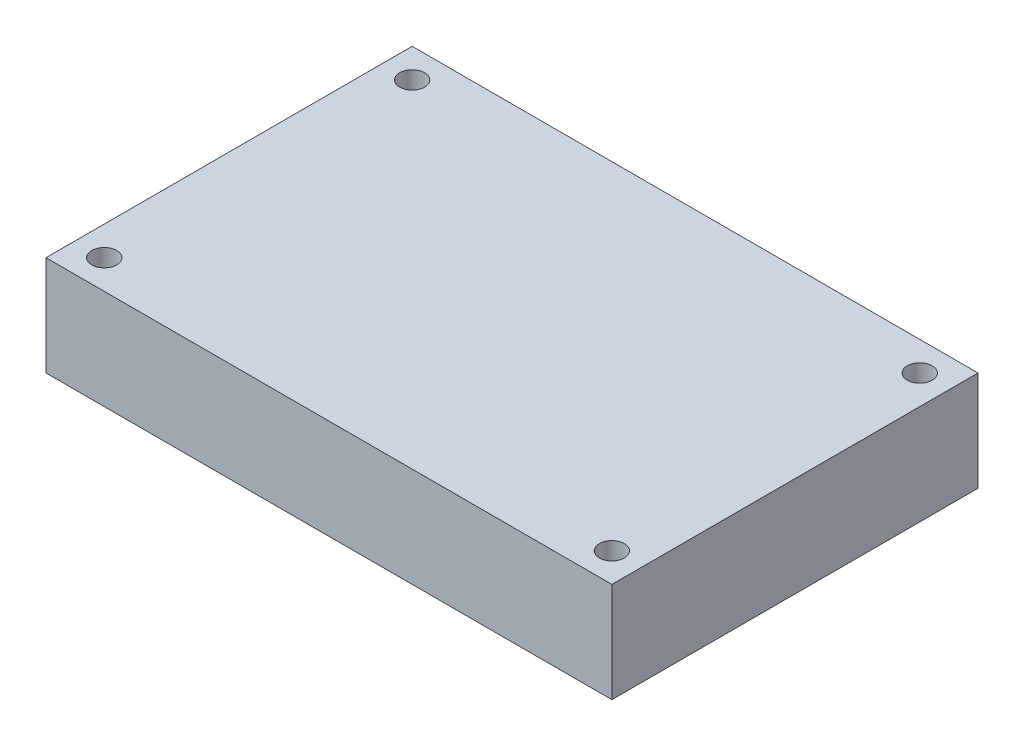
ISO-10303-21;
HEADER;
FILE_DESCRIPTION(('STEP AP214'),'2;1');
FILE_NAME('part.step','',(''),(''),'','','');
FILE_SCHEMA(('AUTOMOTIVE_DESIGN { 1 0 10303 214 1 1 1 1 }'));
ENDSEC;
DATA;
#1=APPLICATION_CONTEXT('core data for automotive mechanical design processes');
#2=APPLICATION_PROTOCOL_DEFINITION('international standard','automotive_design',2000,#1);
#3=PRODUCT_CONTEXT('',#1,'mechanical');
#4=PRODUCT('Part','Part','',(#3));
#5=PRODUCT_RELATED_PRODUCT_CATEGORY('part','',(#4));
#6=PRODUCT_DEFINITION_FORMATION('','',#4);
#7=PRODUCT_DEFINITION_CONTEXT('part definition',#1,'design');
#8=PRODUCT_DEFINITION('design','',#6,#7);
#9=PRODUCT_DEFINITION_SHAPE('','',#8);
#10=(LENGTH_UNIT() NAMED_UNIT(*) SI_UNIT(.MILLI.,.METRE.));
#11=(NAMED_UNIT(*) PLANE_ANGLE_UNIT() SI_UNIT($,.RADIAN.));
#12=(NAMED_UNIT(*) SI_UNIT($,.STERADIAN.) SOLID_ANGLE_UNIT());
#13=UNCERTAINTY_MEASURE_WITH_UNIT(LENGTH_MEASURE(1.E-05),#10,'distance_accuracy_value','');
#14=(GEOMETRIC_REPRESENTATION_CONTEXT(3) GLOBAL_UNCERTAINTY_ASSIGNED_CONTEXT((#13)) GLOBAL_UNIT_ASSIGNED_CONTEXT((#10,
#11,#12)) REPRESENTATION_CONTEXT('',''));
#15=CARTESIAN_POINT('',(0.,0.,0.));
#16=DIRECTION('',(0.,0.,1.));
#17=DIRECTION('',(1.,0.,0.));
#18=AXIS2_PLACEMENT_3D('',#15,#16,#17);
#19=CARTESIAN_POINT('',(0.,12.,0.));
#20=DIRECTION('',(0.,1.,0.));
#21=DIRECTION('',(0.,0.,1.));
#22=AXIS2_PLACEMENT_3D('',#19,#20,#21);
#23=PLANE('',#22);
#24=CARTESIAN_POINT('',(30.5,12.,18.5));
#25=DIRECTION('',(0.,1.,0.));
#26=DIRECTION('',(0.,0.,1.));
#27=AXIS2_PLACEMENT_3D('',#24,#25,#26);
#28=CIRCLE('',#27,1.5);
#29=CARTESIAN_POINT('',(30.5,12.,20.));
#30=VERTEX_POINT('',#29);
#31=EDGE_CURVE('E123',#30,#30,#28,.T.);
#32=ORIENTED_EDGE('',*,*,#31,.F.);
#33=EDGE_LOOP('',(#32));
#34=FACE_BOUND('',#33,.T.);
#35=CARTESIAN_POINT('',(-30.5,12.,-18.5));
#36=DIRECTION('',(0.,1.,0.));
#37=DIRECTION('',(0.,0.,1.));
#38=AXIS2_PLACEMENT_3D('',#35,#36,#37);
#39=CIRCLE('',#38,1.5);
#40=CARTESIAN_POINT('',(-30.5,12.,-17.));
#41=VERTEX_POINT('',#40);
#42=EDGE_CURVE('E102',#41,#41,#39,.T.);
#43=ORIENTED_EDGE('',*,*,#42,.F.);
#44=EDGE_LOOP('',(#43));
#45=FACE_BOUND('',#44,.T.);
#46=DIRECTION('',(0.,0.,-1.));
#47=VECTOR('',#46,1.);
#48=CARTESIAN_POINT('',(34.,12.,-22.));
#49=LINE('',#48,#47);
#50=CARTESIAN_POINT('',(34.,12.,22.));
#51=VERTEX_POINT('',#50);
#52=CARTESIAN_POINT('',(34.,12.,-22.));
#53=VERTEX_POINT('',#52);
#54=EDGE_CURVE('E87',#51,#53,#49,.T.);
#55=ORIENTED_EDGE('',*,*,#54,.T.);
#56=DIRECTION('',(-1.,0.,0.));
#57=VECTOR('',#56,1.);
#58=CARTESIAN_POINT('',(-34.,12.,-22.));
#59=LINE('',#58,#57);
#60=CARTESIAN_POINT('',(-34.,12.,-22.));
#61=VERTEX_POINT('',#60);
#62=EDGE_CURVE('E82',#53,#61,#59,.T.);
#63=ORIENTED_EDGE('',*,*,#62,.T.);
#64=DIRECTION('',(0.,0.,1.));
#65=VECTOR('',#64,1.);
#66=CARTESIAN_POINT('',(-34.,12.,-22.));
#67=LINE('',#66,#65);
#68=CARTESIAN_POINT('',(-34.,12.,22.));
#69=VERTEX_POINT('',#68);
#70=EDGE_CURVE('E85',#61,#69,#67,.T.);
#71=ORIENTED_EDGE('',*,*,#70,.T.);
#72=DIRECTION('',(1.,0.,0.));
#73=VECTOR('',#72,1.);
#74=CARTESIAN_POINT('',(-34.,12.,22.));
#75=LINE('',#74,#73);
#76=EDGE_CURVE('E52',#69,#51,#75,.T.);
#77=ORIENTED_EDGE('',*,*,#76,.T.);
#78=EDGE_LOOP('',(#55,#63,#71,#77));
#79=FACE_BOUND('',#78,.T.);
#80=CARTESIAN_POINT('',(-30.5,12.,18.5));
#81=DIRECTION('',(0.,1.,0.));
#82=DIRECTION('',(0.,0.,1.));
#83=AXIS2_PLACEMENT_3D('',#80,#81,#82);
#84=CIRCLE('',#83,1.5);
#85=CARTESIAN_POINT('',(-30.5,12.,20.));
#86=VERTEX_POINT('',#85);
#87=EDGE_CURVE('E117',#86,#86,#84,.T.);
#88=ORIENTED_EDGE('',*,*,#87,.F.);
#89=EDGE_LOOP('',(#88));
#90=FACE_BOUND('',#89,.T.);
#91=CARTESIAN_POINT('',(30.5,12.,-18.5));
#92=DIRECTION('',(0.,1.,0.));
#93=DIRECTION('',(0.,0.,1.));
#94=AXIS2_PLACEMENT_3D('',#91,#92,#93);
#95=CIRCLE('',#94,1.5);
#96=CARTESIAN_POINT('',(30.5,12.,-17.));
#97=VERTEX_POINT('',#96);
#98=EDGE_CURVE('E129',#97,#97,#95,.T.);
#99=ORIENTED_EDGE('',*,*,#98,.F.);
#100=EDGE_LOOP('',(#99));
#101=FACE_BOUND('',#100,.T.);
#102=ADVANCED_FACE('F35',(#34,#45,#79,#90,#101),#23,.T.);
#103=CARTESIAN_POINT('',(0.,0.,0.));
#104=DIRECTION('',(0.,1.,0.));
#105=DIRECTION('',(0.,0.,1.));
#106=AXIS2_PLACEMENT_3D('',#103,#104,#105);
#107=PLANE('',#106);
#108=DIRECTION('',(0.,0.,-1.));
#109=VECTOR('',#108,1.);
#110=CARTESIAN_POINT('',(34.,0.,-22.));
#111=LINE('',#110,#109);
#112=CARTESIAN_POINT('',(34.,0.,22.));
#113=VERTEX_POINT('',#112);
#114=CARTESIAN_POINT('',(34.,0.,-22.));
#115=VERTEX_POINT('',#114);
#116=EDGE_CURVE('E99',#113,#115,#111,.T.);
#117=ORIENTED_EDGE('',*,*,#116,.F.);
#118=DIRECTION('',(1.,0.,0.));
#119=VECTOR('',#118,1.);
#120=CARTESIAN_POINT('',(-34.,0.,22.));
#121=LINE('',#120,#119);
#122=CARTESIAN_POINT('',(-34.,0.,22.));
#123=VERTEX_POINT('',#122);
#124=EDGE_CURVE('E75',#123,#113,#121,.T.);
#125=ORIENTED_EDGE('',*,*,#124,.F.);
#126=DIRECTION('',(0.,0.,1.));
#127=VECTOR('',#126,1.);
#128=CARTESIAN_POINT('',(-34.,0.,-22.));
#129=LINE('',#128,#127);
#130=CARTESIAN_POINT('',(-34.,0.,-22.));
#131=VERTEX_POINT('',#130);
#132=EDGE_CURVE('E69',#131,#123,#129,.T.);
#133=ORIENTED_EDGE('',*,*,#132,.F.);
#134=DIRECTION('',(-1.,0.,0.));
#135=VECTOR('',#134,1.);
#136=CARTESIAN_POINT('',(-34.,0.,-22.));
#137=LINE('',#136,#135);
#138=EDGE_CURVE('E91',#115,#131,#137,.T.);
#139=ORIENTED_EDGE('',*,*,#138,.F.);
#140=EDGE_LOOP('',(#117,#125,#133,#139));
#141=FACE_BOUND('',#140,.T.);
#142=CARTESIAN_POINT('',(-30.5,0.,-18.5));
#143=DIRECTION('',(0.,1.,0.));
#144=DIRECTION('',(0.,0.,1.));
#145=AXIS2_PLACEMENT_3D('',#142,#143,#144);
#146=CIRCLE('',#145,1.5);
#147=CARTESIAN_POINT('',(-30.5,0.,-17.));
#148=VERTEX_POINT('',#147);
#149=EDGE_CURVE('E114',#148,#148,#146,.T.);
#150=ORIENTED_EDGE('',*,*,#149,.T.);
#151=EDGE_LOOP('',(#150));
#152=FACE_BOUND('',#151,.T.);
#153=CARTESIAN_POINT('',(-30.5,0.,18.5));
#154=DIRECTION('',(0.,1.,0.));
#155=DIRECTION('',(0.,0.,1.));
#156=AXIS2_PLACEMENT_3D('',#153,#154,#155);
#157=CIRCLE('',#156,1.5);
#158=CARTESIAN_POINT('',(-30.5,0.,20.));
#159=VERTEX_POINT('',#158);
#160=EDGE_CURVE('E120',#159,#159,#157,.T.);
#161=ORIENTED_EDGE('',*,*,#160,.T.);
#162=EDGE_LOOP('',(#161));
#163=FACE_BOUND('',#162,.T.);
#164=CARTESIAN_POINT('',(30.5,0.,18.5));
#165=DIRECTION('',(0.,1.,0.));
#166=DIRECTION('',(0.,0.,1.));
#167=AXIS2_PLACEMENT_3D('',#164,#165,#166);
#168=CIRCLE('',#167,1.5);
#169=CARTESIAN_POINT('',(30.5,0.,20.));
#170=VERTEX_POINT('',#169);
#171=EDGE_CURVE('E126',#170,#170,#168,.T.);
#172=ORIENTED_EDGE('',*,*,#171,.T.);
#173=EDGE_LOOP('',(#172));
#174=FACE_BOUND('',#173,.T.);
#175=CARTESIAN_POINT('',(30.5,0.,-18.5));
#176=DIRECTION('',(0.,1.,0.));
#177=DIRECTION('',(0.,0.,1.));
#178=AXIS2_PLACEMENT_3D('',#175,#176,#177);
#179=CIRCLE('',#178,1.5);
#180=CARTESIAN_POINT('',(30.5,0.,-17.));
#181=VERTEX_POINT('',#180);
#182=EDGE_CURVE('E132',#181,#181,#179,.T.);
#183=ORIENTED_EDGE('',*,*,#182,.T.);
#184=EDGE_LOOP('',(#183));
#185=FACE_BOUND('',#184,.T.);
#186=ADVANCED_FACE('F110',(#141,#152,#163,#174,#185),#107,.F.);
#187=CARTESIAN_POINT('',(34.,12.,-22.));
#188=DIRECTION('',(-1.,0.,0.));
#189=DIRECTION('',(0.,0.,1.));
#190=AXIS2_PLACEMENT_3D('',#187,#188,#189);
#191=PLANE('',#190);
#192=ORIENTED_EDGE('',*,*,#116,.T.);
#193=DIRECTION('',(0.,-1.,0.));
#194=VECTOR('',#193,1.);
#195=CARTESIAN_POINT('',(34.,12.,-22.));
#196=LINE('',#195,#194);
#197=EDGE_CURVE('E11',#53,#115,#196,.T.);
#198=ORIENTED_EDGE('',*,*,#197,.F.);
#199=ORIENTED_EDGE('',*,*,#54,.F.);
#200=DIRECTION('',(0.,-1.,0.));
#201=VECTOR('',#200,1.);
#202=CARTESIAN_POINT('',(34.,12.,22.));
#203=LINE('',#202,#201);
#204=EDGE_CURVE('E95',#51,#113,#203,.T.);
#205=ORIENTED_EDGE('',*,*,#204,.T.);
#206=EDGE_LOOP('',(#192,#198,#199,#205));
#207=FACE_BOUND('',#206,.T.);
#208=ADVANCED_FACE('F37',(#207),#191,.F.);
#209=CARTESIAN_POINT('',(-34.,12.,-22.));
#210=DIRECTION('',(0.,0.,1.));
#211=DIRECTION('',(1.,0.,0.));
#212=AXIS2_PLACEMENT_3D('',#209,#210,#211);
#213=PLANE('',#212);
#214=ORIENTED_EDGE('',*,*,#138,.T.);
#215=DIRECTION('',(0.,-1.,0.));
#216=VECTOR('',#215,1.);
#217=CARTESIAN_POINT('',(-34.,12.,-22.));
#218=LINE('',#217,#216);
#219=EDGE_CURVE('E44',#61,#131,#218,.T.);
#220=ORIENTED_EDGE('',*,*,#219,.F.);
#221=ORIENTED_EDGE('',*,*,#62,.F.);
#222=ORIENTED_EDGE('',*,*,#197,.T.);
#223=EDGE_LOOP('',(#214,#220,#221,#222));
#224=FACE_BOUND('',#223,.T.);
#225=ADVANCED_FACE('F90',(#224),#213,.F.);
#226=CARTESIAN_POINT('',(-34.,12.,-22.));
#227=DIRECTION('',(1.,0.,0.));
#228=DIRECTION('',(0.,0.,-1.));
#229=AXIS2_PLACEMENT_3D('',#226,#227,#228);
#230=PLANE('',#229);
#231=ORIENTED_EDGE('',*,*,#132,.T.);
#232=DIRECTION('',(0.,-1.,0.));
#233=VECTOR('',#232,1.);
#234=CARTESIAN_POINT('',(-34.,12.,22.));
#235=LINE('',#234,#233);
#236=EDGE_CURVE('E92',#69,#123,#235,.T.);
#237=ORIENTED_EDGE('',*,*,#236,.F.);
#238=ORIENTED_EDGE('',*,*,#70,.F.);
#239=ORIENTED_EDGE('',*,*,#219,.T.);
#240=EDGE_LOOP('',(#231,#237,#238,#239));
#241=FACE_BOUND('',#240,.T.);
#242=ADVANCED_FACE('F93',(#241),#230,.F.);
#243=CARTESIAN_POINT('',(-34.,12.,22.));
#244=DIRECTION('',(0.,0.,-1.));
#245=DIRECTION('',(-1.,0.,0.));
#246=AXIS2_PLACEMENT_3D('',#243,#244,#245);
#247=PLANE('',#246);
#248=ORIENTED_EDGE('',*,*,#124,.T.);
#249=ORIENTED_EDGE('',*,*,#204,.F.);
#250=ORIENTED_EDGE('',*,*,#76,.F.);
#251=ORIENTED_EDGE('',*,*,#236,.T.);
#252=EDGE_LOOP('',(#248,#249,#250,#251));
#253=FACE_BOUND('',#252,.T.);
#254=ADVANCED_FACE('F107',(#253),#247,.F.);
#255=CARTESIAN_POINT('',(-30.5,12.,-18.5));
#256=DIRECTION('',(0.,-1.,0.));
#257=DIRECTION('',(0.,0.,-1.));
#258=AXIS2_PLACEMENT_3D('',#255,#256,#257);
#259=CYLINDRICAL_SURFACE('',#258,1.5);
#260=ORIENTED_EDGE('',*,*,#42,.T.);
#261=EDGE_LOOP('',(#260));
#262=FACE_BOUND('',#261,.T.);
#263=ORIENTED_EDGE('',*,*,#149,.F.);
#264=EDGE_LOOP('',(#263));
#265=FACE_BOUND('',#264,.T.);
#266=ADVANCED_FACE('F151',(#262,#265),#259,.F.);
#267=CARTESIAN_POINT('',(-30.5,12.,18.5));
#268=DIRECTION('',(0.,-1.,0.));
#269=DIRECTION('',(0.,0.,-1.));
#270=AXIS2_PLACEMENT_3D('',#267,#268,#269);
#271=CYLINDRICAL_SURFACE('',#270,1.5);
#272=ORIENTED_EDGE('',*,*,#87,.T.);
#273=EDGE_LOOP('',(#272));
#274=FACE_BOUND('',#273,.T.);
#275=ORIENTED_EDGE('',*,*,#160,.F.);
#276=EDGE_LOOP('',(#275));
#277=FACE_BOUND('',#276,.T.);
#278=ADVANCED_FACE('F197',(#274,#277),#271,.F.);
#279=CARTESIAN_POINT('',(30.5,12.,18.5));
#280=DIRECTION('',(0.,-1.,0.));
#281=DIRECTION('',(0.,0.,-1.));
#282=AXIS2_PLACEMENT_3D('',#279,#280,#281);
#283=CYLINDRICAL_SURFACE('',#282,1.5);
#284=ORIENTED_EDGE('',*,*,#31,.T.);
#285=EDGE_LOOP('',(#284));
#286=FACE_BOUND('',#285,.T.);
#287=ORIENTED_EDGE('',*,*,#171,.F.);
#288=EDGE_LOOP('',(#287));
#289=FACE_BOUND('',#288,.T.);
#290=ADVANCED_FACE('F205',(#286,#289),#283,.F.);
#291=CARTESIAN_POINT('',(30.5,12.,-18.5));
#292=DIRECTION('',(0.,-1.,0.));
#293=DIRECTION('',(0.,0.,-1.));
#294=AXIS2_PLACEMENT_3D('',#291,#292,#293);
#295=CYLINDRICAL_SURFACE('',#294,1.5);
#296=ORIENTED_EDGE('',*,*,#98,.T.);
#297=EDGE_LOOP('',(#296));
#298=FACE_BOUND('',#297,.T.);
#299=ORIENTED_EDGE('',*,*,#182,.F.);
#300=EDGE_LOOP('',(#299));
#301=FACE_BOUND('',#300,.T.);
#302=ADVANCED_FACE('F138',(#298,#301),#295,.F.);
#303=CLOSED_SHELL('',(#102,#186,#208,#225,#242,#254,#266,#278,#290,#302));
#304=MANIFOLD_SOLID_BREP('B2',#303);
#305=ADVANCED_BREP_SHAPE_REPRESENTATION('',(#18,#304),#14);
#306=SHAPE_DEFINITION_REPRESENTATION(#9,#305);
ENDSEC;
END-ISO-10303-21;
